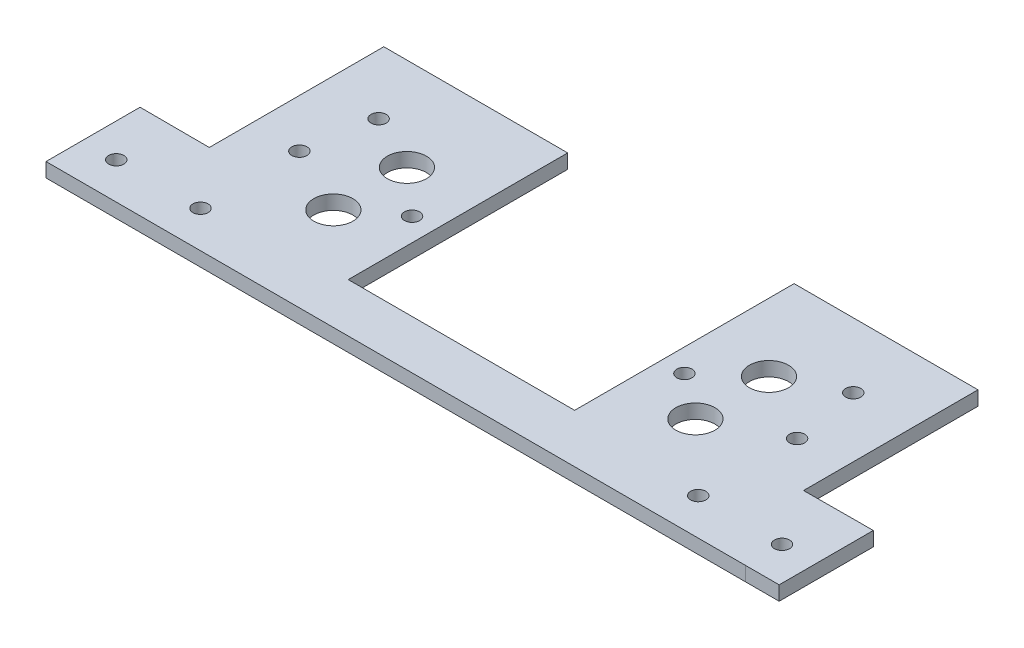
ISO-10303-21;
HEADER;
FILE_DESCRIPTION(('STEP AP214'),'2;1');
FILE_NAME('part.step','',(''),(''),'','','');
FILE_SCHEMA(('AUTOMOTIVE_DESIGN { 1 0 10303 214 1 1 1 1 }'));
ENDSEC;
DATA;
#1=APPLICATION_CONTEXT('core data for automotive mechanical design processes');
#2=APPLICATION_PROTOCOL_DEFINITION('international standard','automotive_design',2000,#1);
#3=PRODUCT_CONTEXT('',#1,'mechanical');
#4=PRODUCT('Part','Part','',(#3));
#5=PRODUCT_RELATED_PRODUCT_CATEGORY('part','',(#4));
#6=PRODUCT_DEFINITION_FORMATION('','',#4);
#7=PRODUCT_DEFINITION_CONTEXT('part definition',#1,'design');
#8=PRODUCT_DEFINITION('design','',#6,#7);
#9=PRODUCT_DEFINITION_SHAPE('','',#8);
#10=(LENGTH_UNIT() NAMED_UNIT(*) SI_UNIT(.MILLI.,.METRE.));
#11=(NAMED_UNIT(*) PLANE_ANGLE_UNIT() SI_UNIT($,.RADIAN.));
#12=(NAMED_UNIT(*) SI_UNIT($,.STERADIAN.) SOLID_ANGLE_UNIT());
#13=UNCERTAINTY_MEASURE_WITH_UNIT(LENGTH_MEASURE(1.E-05),#10,'distance_accuracy_value','');
#14=(GEOMETRIC_REPRESENTATION_CONTEXT(3) GLOBAL_UNCERTAINTY_ASSIGNED_CONTEXT((#13)) GLOBAL_UNIT_ASSIGNED_CONTEXT((#10,
#11,#12)) REPRESENTATION_CONTEXT('',''));
#15=CARTESIAN_POINT('',(0.,0.,0.));
#16=DIRECTION('',(0.,0.,1.));
#17=DIRECTION('',(1.,0.,0.));
#18=AXIS2_PLACEMENT_3D('',#15,#16,#17);
#19=CARTESIAN_POINT('',(0.,1.575,0.));
#20=DIRECTION('',(0.,-1.,0.));
#21=DIRECTION('',(0.,0.,-1.));
#22=AXIS2_PLACEMENT_3D('',#19,#20,#21);
#23=PLANE('',#22);
#24=CARTESIAN_POINT('',(27.8443972991951,1.575,35.9479468919469));
#25=DIRECTION('',(0.,-1.,0.));
#26=DIRECTION('',(0.,0.,-1.));
#27=AXIS2_PLACEMENT_3D('',#24,#25,#26);
#28=CIRCLE('',#27,0.838199999999997);
#29=CARTESIAN_POINT('',(27.8443972991951,1.575,35.1097468919469));
#30=VERTEX_POINT('',#29);
#31=EDGE_CURVE('E700',#30,#30,#28,.T.);
#32=ORIENTED_EDGE('',*,*,#31,.T.);
#33=EDGE_LOOP('',(#32));
#34=FACE_BOUND('',#33,.T.);
#35=CARTESIAN_POINT('',(27.8443972991951,1.575,25.0259468919469));
#36=DIRECTION('',(0.,-1.,0.));
#37=DIRECTION('',(0.,0.,-1.));
#38=AXIS2_PLACEMENT_3D('',#35,#36,#37);
#39=CIRCLE('',#38,0.838200000000001);
#40=CARTESIAN_POINT('',(27.8443972991951,1.575,24.1877468919469));
#41=VERTEX_POINT('',#40);
#42=EDGE_CURVE('E694',#41,#41,#39,.T.);
#43=ORIENTED_EDGE('',*,*,#42,.T.);
#44=EDGE_LOOP('',(#43));
#45=FACE_BOUND('',#44,.T.);
#46=CARTESIAN_POINT('',(15.3981432991951,1.575,25.0259468919469));
#47=DIRECTION('',(0.,-1.,0.));
#48=DIRECTION('',(0.,0.,-1.));
#49=AXIS2_PLACEMENT_3D('',#46,#47,#48);
#50=CIRCLE('',#49,0.838200000000005);
#51=CARTESIAN_POINT('',(15.3981432991951,1.575,24.1877468919469));
#52=VERTEX_POINT('',#51);
#53=EDGE_CURVE('E688',#52,#52,#50,.T.);
#54=ORIENTED_EDGE('',*,*,#53,.T.);
#55=EDGE_LOOP('',(#54));
#56=FACE_BOUND('',#55,.T.);
#57=CARTESIAN_POINT('',(-14.695556700805,1.575,25.0259468919469));
#58=DIRECTION('',(0.,-1.,0.));
#59=DIRECTION('',(0.,0.,-1.));
#60=AXIS2_PLACEMENT_3D('',#57,#58,#59);
#61=CIRCLE('',#60,0.838200000000001);
#62=CARTESIAN_POINT('',(-14.695556700805,1.575,24.1877468919469));
#63=VERTEX_POINT('',#62);
#64=EDGE_CURVE('E682',#63,#63,#61,.T.);
#65=ORIENTED_EDGE('',*,*,#64,.T.);
#66=EDGE_LOOP('',(#65));
#67=FACE_BOUND('',#66,.T.);
#68=CARTESIAN_POINT('',(-27.141556700805,1.575,25.0259468919469));
#69=DIRECTION('',(0.,-1.,0.));
#70=DIRECTION('',(0.,0.,-1.));
#71=AXIS2_PLACEMENT_3D('',#68,#69,#70);
#72=CIRCLE('',#71,0.838200000000001);
#73=CARTESIAN_POINT('',(-27.141556700805,1.575,24.1877468919469));
#74=VERTEX_POINT('',#73);
#75=EDGE_CURVE('E674',#74,#74,#72,.T.);
#76=ORIENTED_EDGE('',*,*,#75,.T.);
#77=EDGE_LOOP('',(#76));
#78=FACE_BOUND('',#77,.T.);
#79=CARTESIAN_POINT('',(-27.141556700805,1.575,35.9479468919469));
#80=DIRECTION('',(0.,-1.,0.));
#81=DIRECTION('',(0.,0.,-1.));
#82=AXIS2_PLACEMENT_3D('',#79,#80,#81);
#83=CIRCLE('',#82,0.838200000000004);
#84=CARTESIAN_POINT('',(-27.141556700805,1.575,35.1097468919469));
#85=VERTEX_POINT('',#84);
#86=EDGE_CURVE('E667',#85,#85,#83,.T.);
#87=ORIENTED_EDGE('',*,*,#86,.T.);
#88=EDGE_LOOP('',(#87));
#89=FACE_BOUND('',#88,.T.);
#90=CARTESIAN_POINT('',(26.5712932991951,1.575,17.5478756011429));
#91=DIRECTION('',(0.,1.,0.));
#92=DIRECTION('',(0.,0.,1.));
#93=AXIS2_PLACEMENT_3D('',#90,#91,#92);
#94=CIRCLE('',#93,0.838199999999997);
#95=CARTESIAN_POINT('',(26.5712932991951,1.575,18.3860756011429));
#96=VERTEX_POINT('',#95);
#97=EDGE_CURVE('E286',#96,#96,#94,.T.);
#98=ORIENTED_EDGE('',*,*,#97,.F.);
#99=EDGE_LOOP('',(#98));
#100=FACE_BOUND('',#99,.T.);
#101=CARTESIAN_POINT('',(20.351397299195,1.575,28.7673833497151));
#102=DIRECTION('',(0.,1.,0.));
#103=DIRECTION('',(0.,0.,1.));
#104=AXIS2_PLACEMENT_3D('',#101,#102,#103);
#105=CIRCLE('',#104,2.159);
#106=CARTESIAN_POINT('',(20.351397299195,1.575,30.9263833497151));
#107=VERTEX_POINT('',#106);
#108=EDGE_CURVE('E298',#107,#107,#105,.T.);
#109=ORIENTED_EDGE('',*,*,#108,.F.);
#110=EDGE_LOOP('',(#109));
#111=FACE_BOUND('',#110,.T.);
#112=CARTESIAN_POINT('',(-19.648556700805,1.575,20.6393833497151));
#113=DIRECTION('',(0.,1.,0.));
#114=DIRECTION('',(0.,0.,1.));
#115=AXIS2_PLACEMENT_3D('',#112,#113,#114);
#116=CIRCLE('',#115,2.159);
#117=CARTESIAN_POINT('',(-19.648556700805,1.575,22.7983833497151));
#118=VERTEX_POINT('',#117);
#119=EDGE_CURVE('E310',#118,#118,#116,.T.);
#120=ORIENTED_EDGE('',*,*,#119,.F.);
#121=EDGE_LOOP('',(#120));
#122=FACE_BOUND('',#121,.T.);
#123=CARTESIAN_POINT('',(-19.648556700805,1.575,28.7673833497151));
#124=DIRECTION('',(0.,1.,0.));
#125=DIRECTION('',(0.,0.,1.));
#126=AXIS2_PLACEMENT_3D('',#123,#124,#125);
#127=CIRCLE('',#126,2.159);
#128=CARTESIAN_POINT('',(-19.648556700805,1.575,30.9263833497151));
#129=VERTEX_POINT('',#128);
#130=EDGE_CURVE('E192',#129,#129,#127,.T.);
#131=ORIENTED_EDGE('',*,*,#130,.F.);
#132=EDGE_LOOP('',(#131));
#133=FACE_BOUND('',#132,.T.);
#134=DIRECTION('',(1.,0.,0.));
#135=VECTOR('',#134,1.);
#136=CARTESIAN_POINT('',(44.3512932991951,1.575,40.0144122461493));
#137=LINE('',#136,#135);
#138=CARTESIAN_POINT('',(37.1362932991951,1.575,40.0144122461493));
#139=VERTEX_POINT('',#138);
#140=CARTESIAN_POINT('',(40.8512932991951,1.575,40.0144122461493));
#141=VERTEX_POINT('',#140);
#142=EDGE_CURVE('E153',#139,#141,#137,.T.);
#143=ORIENTED_EDGE('',*,*,#142,.T.);
#144=DIRECTION('',(0.,0.,-1.));
#145=VECTOR('',#144,1.);
#146=CARTESIAN_POINT('',(40.8512932991951,1.575,40.0144122461493));
#147=LINE('',#146,#145);
#148=CARTESIAN_POINT('',(40.8512932991951,1.575,29.615946891947));
#149=VERTEX_POINT('',#148);
#150=EDGE_CURVE('E141',#141,#149,#147,.T.);
#151=ORIENTED_EDGE('',*,*,#150,.T.);
#152=DIRECTION('',(-1.,0.,0.));
#153=VECTOR('',#152,1.);
#154=CARTESIAN_POINT('',(42.3512933071951,1.575,29.615946891947));
#155=LINE('',#154,#153);
#156=CARTESIAN_POINT('',(38.7462933071951,1.575,29.615946891947));
#157=VERTEX_POINT('',#156);
#158=EDGE_CURVE('E161',#149,#157,#155,.T.);
#159=ORIENTED_EDGE('',*,*,#158,.T.);
#160=DIRECTION('',(-0.999983503458794,0.,0.00574393682727106));
#161=VECTOR('',#160,1.);
#162=CARTESIAN_POINT('',(38.7462933071951,1.575,29.615946891947));
#163=LINE('',#162,#161);
#164=CARTESIAN_POINT('',(33.1752932991951,1.575,29.647946891947));
#165=VERTEX_POINT('',#164);
#166=EDGE_CURVE('E164',#157,#165,#163,.T.);
#167=ORIENTED_EDGE('',*,*,#166,.T.);
#168=DIRECTION('',(0.,0.,-1.));
#169=VECTOR('',#168,1.);
#170=CARTESIAN_POINT('',(33.1752932991951,1.575,12.929386891947));
#171=LINE('',#170,#169);
#172=CARTESIAN_POINT('',(33.1752932991951,1.575,10.3704284449379));
#173=VERTEX_POINT('',#172);
#174=EDGE_CURVE('E173',#165,#173,#171,.T.);
#175=ORIENTED_EDGE('',*,*,#174,.T.);
#176=DIRECTION('',(-1.,0.,0.));
#177=VECTOR('',#176,1.);
#178=CARTESIAN_POINT('',(12.8581432991951,1.575,10.3704284449379));
#179=LINE('',#178,#177);
#180=CARTESIAN_POINT('',(12.8581432991951,1.575,10.3704284449379));
#181=VERTEX_POINT('',#180);
#182=EDGE_CURVE('E175',#173,#181,#179,.T.);
#183=ORIENTED_EDGE('',*,*,#182,.T.);
#184=DIRECTION('',(0.,0.,1.));
#185=VECTOR('',#184,1.);
#186=CARTESIAN_POINT('',(12.8581432991951,1.575,34.615947015947));
#187=LINE('',#186,#185);
#188=CARTESIAN_POINT('',(12.8581432991951,1.575,34.615947015947));
#189=VERTEX_POINT('',#188);
#190=EDGE_CURVE('E177',#181,#189,#187,.T.);
#191=ORIENTED_EDGE('',*,*,#190,.T.);
#192=DIRECTION('',(-1.,0.,0.));
#193=VECTOR('',#192,1.);
#194=CARTESIAN_POINT('',(12.2602932991951,1.575,34.615947015947));
#195=LINE('',#194,#193);
#196=CARTESIAN_POINT('',(-12.155556700805,1.575,34.6159470159469));
#197=VERTEX_POINT('',#196);
#198=EDGE_CURVE('E179',#189,#197,#195,.T.);
#199=ORIENTED_EDGE('',*,*,#198,.T.);
#200=DIRECTION('',(0.,0.,-1.));
#201=VECTOR('',#200,1.);
#202=CARTESIAN_POINT('',(-12.155556700805,1.575,34.6159470159469));
#203=LINE('',#202,#201);
#204=CARTESIAN_POINT('',(-12.155556700805,1.575,10.3704284449379));
#205=VERTEX_POINT('',#204);
#206=EDGE_CURVE('E181',#197,#205,#203,.T.);
#207=ORIENTED_EDGE('',*,*,#206,.T.);
#208=DIRECTION('',(-1.,0.,0.));
#209=VECTOR('',#208,1.);
#210=CARTESIAN_POINT('',(-12.155556700805,1.575,10.3704284449379));
#211=LINE('',#210,#209);
#212=CARTESIAN_POINT('',(-32.4727067008049,1.575,10.3704284449379));
#213=VERTEX_POINT('',#212);
#214=EDGE_CURVE('E183',#205,#213,#211,.T.);
#215=ORIENTED_EDGE('',*,*,#214,.T.);
#216=DIRECTION('',(0.,0.,1.));
#217=VECTOR('',#216,1.);
#218=CARTESIAN_POINT('',(-32.4727067008049,1.575,10.3704284449379));
#219=LINE('',#218,#217);
#220=CARTESIAN_POINT('',(-32.4727067008049,1.575,29.647946891947));
#221=VERTEX_POINT('',#220);
#222=EDGE_CURVE('E185',#213,#221,#219,.T.);
#223=ORIENTED_EDGE('',*,*,#222,.T.);
#224=DIRECTION('',(-0.999994782410405,0.,-0.00323034858297765));
#225=VECTOR('',#224,1.);
#226=CARTESIAN_POINT('',(-42.3787066928049,1.575,29.615946891947));
#227=LINE('',#226,#225);
#228=CARTESIAN_POINT('',(-40.1487067008049,1.575,29.6231506068472));
#229=VERTEX_POINT('',#228);
#230=EDGE_CURVE('E187',#221,#229,#227,.T.);
#231=ORIENTED_EDGE('',*,*,#230,.T.);
#232=DIRECTION('',(0.,0.,1.));
#233=VECTOR('',#232,1.);
#234=CARTESIAN_POINT('',(-40.1487067008049,1.575,40.013946891947));
#235=LINE('',#234,#233);
#236=CARTESIAN_POINT('',(-40.1487067008049,1.575,40.013946891947));
#237=VERTEX_POINT('',#236);
#238=EDGE_CURVE('E259',#229,#237,#235,.T.);
#239=ORIENTED_EDGE('',*,*,#238,.T.);
#240=DIRECTION('',(1.,0.,0.));
#241=VECTOR('',#240,1.);
#242=CARTESIAN_POINT('',(-49.1063653425043,1.575,40.013946891947));
#243=LINE('',#242,#241);
#244=CARTESIAN_POINT('',(37.1362932991951,1.575,40.013946891947));
#245=VERTEX_POINT('',#244);
#246=EDGE_CURVE('E271',#237,#245,#243,.T.);
#247=ORIENTED_EDGE('',*,*,#246,.T.);
#248=DIRECTION('',(0.,0.,1.));
#249=VECTOR('',#248,1.);
#250=CARTESIAN_POINT('',(37.1362932991951,1.575,40.013946891947));
#251=LINE('',#250,#249);
#252=EDGE_CURVE('E160',#245,#139,#251,.T.);
#253=ORIENTED_EDGE('',*,*,#252,.T.);
#254=EDGE_LOOP('',(#143,#151,#159,#167,#175,#183,#191,#199,#207,#215,#223,#231,#239,#247,#253));
#255=FACE_BOUND('',#254,.T.);
#256=CARTESIAN_POINT('',(37.1362932991951,1.575,35.983946891947));
#257=DIRECTION('',(0.,1.,0.));
#258=DIRECTION('',(0.,0.,1.));
#259=AXIS2_PLACEMENT_3D('',#256,#257,#258);
#260=CIRCLE('',#259,0.838199999999997);
#261=CARTESIAN_POINT('',(37.1362932991951,1.575,36.822146891947));
#262=VERTEX_POINT('',#261);
#263=EDGE_CURVE('E316',#262,#262,#260,.T.);
#264=ORIENTED_EDGE('',*,*,#263,.F.);
#265=EDGE_LOOP('',(#264));
#266=FACE_BOUND('',#265,.T.);
#267=CARTESIAN_POINT('',(20.351397299195,1.575,20.6393833497151));
#268=DIRECTION('',(0.,1.,0.));
#269=DIRECTION('',(0.,0.,1.));
#270=AXIS2_PLACEMENT_3D('',#267,#268,#269);
#271=CIRCLE('',#270,2.159);
#272=CARTESIAN_POINT('',(20.351397299195,1.575,22.7983833497151));
#273=VERTEX_POINT('',#272);
#274=EDGE_CURVE('E304',#273,#273,#271,.T.);
#275=ORIENTED_EDGE('',*,*,#274,.F.);
#276=EDGE_LOOP('',(#275));
#277=FACE_BOUND('',#276,.T.);
#278=CARTESIAN_POINT('',(-25.8687067008049,1.575,17.5478756011429));
#279=DIRECTION('',(0.,1.,0.));
#280=DIRECTION('',(0.,0.,1.));
#281=AXIS2_PLACEMENT_3D('',#278,#279,#280);
#282=CIRCLE('',#281,0.838200000000001);
#283=CARTESIAN_POINT('',(-25.8687067008049,1.575,18.3860756011429));
#284=VERTEX_POINT('',#283);
#285=EDGE_CURVE('E292',#284,#284,#282,.T.);
#286=ORIENTED_EDGE('',*,*,#285,.F.);
#287=EDGE_LOOP('',(#286));
#288=FACE_BOUND('',#287,.T.);
#289=CARTESIAN_POINT('',(-36.433706700805,1.575,35.9659468919469));
#290=DIRECTION('',(0.,1.,0.));
#291=DIRECTION('',(0.,0.,1.));
#292=AXIS2_PLACEMENT_3D('',#289,#290,#291);
#293=CIRCLE('',#292,0.838199999999995);
#294=CARTESIAN_POINT('',(-36.433706700805,1.575,36.8041468919469));
#295=VERTEX_POINT('',#294);
#296=EDGE_CURVE('E280',#295,#295,#293,.T.);
#297=ORIENTED_EDGE('',*,*,#296,.F.);
#298=EDGE_LOOP('',(#297));
#299=FACE_BOUND('',#298,.T.);
#300=ADVANCED_FACE('F35',(#34,#45,#56,#67,#78,#89,#100,#111,#122,#133,#255,#266,#277,#288,#299),
#23,.F.);
#301=CARTESIAN_POINT('',(0.,0.,0.));
#302=DIRECTION('',(0.,-1.,0.));
#303=DIRECTION('',(0.,0.,-1.));
#304=AXIS2_PLACEMENT_3D('',#301,#302,#303);
#305=PLANE('',#304);
#306=CARTESIAN_POINT('',(27.8443972991951,0.,35.9479468919469));
#307=DIRECTION('',(0.,-1.,0.));
#308=DIRECTION('',(0.,0.,-1.));
#309=AXIS2_PLACEMENT_3D('',#306,#307,#308);
#310=CIRCLE('',#309,0.838199999999997);
#311=CARTESIAN_POINT('',(27.8443972991951,0.,35.1097468919469));
#312=VERTEX_POINT('',#311);
#313=EDGE_CURVE('E702',#312,#312,#310,.T.);
#314=ORIENTED_EDGE('',*,*,#313,.F.);
#315=EDGE_LOOP('',(#314));
#316=FACE_BOUND('',#315,.T.);
#317=CARTESIAN_POINT('',(27.8443972991951,0.,25.0259468919469));
#318=DIRECTION('',(0.,-1.,0.));
#319=DIRECTION('',(0.,0.,-1.));
#320=AXIS2_PLACEMENT_3D('',#317,#318,#319);
#321=CIRCLE('',#320,0.838200000000001);
#322=CARTESIAN_POINT('',(27.8443972991951,0.,24.1877468919469));
#323=VERTEX_POINT('',#322);
#324=EDGE_CURVE('E697',#323,#323,#321,.T.);
#325=ORIENTED_EDGE('',*,*,#324,.F.);
#326=EDGE_LOOP('',(#325));
#327=FACE_BOUND('',#326,.T.);
#328=CARTESIAN_POINT('',(15.3981432991951,0.,25.0259468919469));
#329=DIRECTION('',(0.,-1.,0.));
#330=DIRECTION('',(0.,0.,-1.));
#331=AXIS2_PLACEMENT_3D('',#328,#329,#330);
#332=CIRCLE('',#331,0.838200000000005);
#333=CARTESIAN_POINT('',(15.3981432991951,0.,24.1877468919469));
#334=VERTEX_POINT('',#333);
#335=EDGE_CURVE('E691',#334,#334,#332,.T.);
#336=ORIENTED_EDGE('',*,*,#335,.F.);
#337=EDGE_LOOP('',(#336));
#338=FACE_BOUND('',#337,.T.);
#339=CARTESIAN_POINT('',(-14.695556700805,0.,25.0259468919469));
#340=DIRECTION('',(0.,-1.,0.));
#341=DIRECTION('',(0.,0.,-1.));
#342=AXIS2_PLACEMENT_3D('',#339,#340,#341);
#343=CIRCLE('',#342,0.838200000000001);
#344=CARTESIAN_POINT('',(-14.695556700805,0.,24.1877468919469));
#345=VERTEX_POINT('',#344);
#346=EDGE_CURVE('E685',#345,#345,#343,.T.);
#347=ORIENTED_EDGE('',*,*,#346,.F.);
#348=EDGE_LOOP('',(#347));
#349=FACE_BOUND('',#348,.T.);
#350=CARTESIAN_POINT('',(-27.141556700805,0.,25.0259468919469));
#351=DIRECTION('',(0.,-1.,0.));
#352=DIRECTION('',(0.,0.,-1.));
#353=AXIS2_PLACEMENT_3D('',#350,#351,#352);
#354=CIRCLE('',#353,0.838200000000001);
#355=CARTESIAN_POINT('',(-27.141556700805,0.,24.1877468919469));
#356=VERTEX_POINT('',#355);
#357=EDGE_CURVE('E679',#356,#356,#354,.T.);
#358=ORIENTED_EDGE('',*,*,#357,.F.);
#359=EDGE_LOOP('',(#358));
#360=FACE_BOUND('',#359,.T.);
#361=CARTESIAN_POINT('',(-27.141556700805,0.,35.9479468919469));
#362=DIRECTION('',(0.,-1.,0.));
#363=DIRECTION('',(0.,0.,-1.));
#364=AXIS2_PLACEMENT_3D('',#361,#362,#363);
#365=CIRCLE('',#364,0.838200000000004);
#366=CARTESIAN_POINT('',(-27.141556700805,0.,35.1097468919469));
#367=VERTEX_POINT('',#366);
#368=EDGE_CURVE('E669',#367,#367,#365,.T.);
#369=ORIENTED_EDGE('',*,*,#368,.F.);
#370=EDGE_LOOP('',(#369));
#371=FACE_BOUND('',#370,.T.);
#372=DIRECTION('',(0.,0.,-1.));
#373=VECTOR('',#372,1.);
#374=CARTESIAN_POINT('',(40.8512932991951,0.,32.4201044546138));
#375=LINE('',#374,#373);
#376=CARTESIAN_POINT('',(40.8512932991951,0.,40.0144122461493));
#377=VERTEX_POINT('',#376);
#378=CARTESIAN_POINT('',(40.8512932991951,0.,29.615946891947));
#379=VERTEX_POINT('',#378);
#380=EDGE_CURVE('E50',#377,#379,#375,.T.);
#381=ORIENTED_EDGE('',*,*,#380,.F.);
#382=DIRECTION('',(1.,0.,0.));
#383=VECTOR('',#382,1.);
#384=CARTESIAN_POINT('',(44.3512932991951,0.,40.0144122461493));
#385=LINE('',#384,#383);
#386=CARTESIAN_POINT('',(37.1362932991951,0.,40.0144122461493));
#387=VERTEX_POINT('',#386);
#388=EDGE_CURVE('E155',#387,#377,#385,.T.);
#389=ORIENTED_EDGE('',*,*,#388,.F.);
#390=DIRECTION('',(0.,0.,1.));
#391=VECTOR('',#390,1.);
#392=CARTESIAN_POINT('',(37.1362932991951,0.,40.013946891947));
#393=LINE('',#392,#391);
#394=CARTESIAN_POINT('',(37.1362932991951,0.,40.013946891947));
#395=VERTEX_POINT('',#394);
#396=EDGE_CURVE('E268',#395,#387,#393,.T.);
#397=ORIENTED_EDGE('',*,*,#396,.F.);
#398=DIRECTION('',(1.,0.,0.));
#399=VECTOR('',#398,1.);
#400=CARTESIAN_POINT('',(-49.1063653425043,0.,40.013946891947));
#401=LINE('',#400,#399);
#402=CARTESIAN_POINT('',(-40.1487067008049,0.,40.013946891947));
#403=VERTEX_POINT('',#402);
#404=EDGE_CURVE('E272',#403,#395,#401,.T.);
#405=ORIENTED_EDGE('',*,*,#404,.F.);
#406=DIRECTION('',(0.,0.,1.));
#407=VECTOR('',#406,1.);
#408=CARTESIAN_POINT('',(-40.1487067008049,0.,40.013946891947));
#409=LINE('',#408,#407);
#410=CARTESIAN_POINT('',(-40.1487067008049,0.,29.6231506068472));
#411=VERTEX_POINT('',#410);
#412=EDGE_CURVE('E58',#411,#403,#409,.T.);
#413=ORIENTED_EDGE('',*,*,#412,.F.);
#414=DIRECTION('',(-0.999994782410405,0.,-0.00323034858297765));
#415=VECTOR('',#414,1.);
#416=CARTESIAN_POINT('',(-42.3787066928049,0.,29.615946891947));
#417=LINE('',#416,#415);
#418=CARTESIAN_POINT('',(-32.4727067008049,0.,29.647946891947));
#419=VERTEX_POINT('',#418);
#420=EDGE_CURVE('E162',#419,#411,#417,.T.);
#421=ORIENTED_EDGE('',*,*,#420,.F.);
#422=DIRECTION('',(0.,0.,1.));
#423=VECTOR('',#422,1.);
#424=CARTESIAN_POINT('',(-32.4727067008049,0.,10.3704284449379));
#425=LINE('',#424,#423);
#426=CARTESIAN_POINT('',(-32.4727067008049,0.,10.3704284449379));
#427=VERTEX_POINT('',#426);
#428=EDGE_CURVE('E166',#427,#419,#425,.T.);
#429=ORIENTED_EDGE('',*,*,#428,.F.);
#430=DIRECTION('',(-1.,0.,0.));
#431=VECTOR('',#430,1.);
#432=CARTESIAN_POINT('',(-12.155556700805,0.,10.3704284449379));
#433=LINE('',#432,#431);
#434=CARTESIAN_POINT('',(-12.155556700805,0.,10.3704284449379));
#435=VERTEX_POINT('',#434);
#436=EDGE_CURVE('E208',#435,#427,#433,.T.);
#437=ORIENTED_EDGE('',*,*,#436,.F.);
#438=DIRECTION('',(0.,0.,-1.));
#439=VECTOR('',#438,1.);
#440=CARTESIAN_POINT('',(-12.155556700805,0.,34.6159470159469));
#441=LINE('',#440,#439);
#442=CARTESIAN_POINT('',(-12.155556700805,0.,34.6159470159469));
#443=VERTEX_POINT('',#442);
#444=EDGE_CURVE('E206',#443,#435,#441,.T.);
#445=ORIENTED_EDGE('',*,*,#444,.F.);
#446=DIRECTION('',(-1.,0.,0.));
#447=VECTOR('',#446,1.);
#448=CARTESIAN_POINT('',(-11.5577067008049,0.,34.6159470159469));
#449=LINE('',#448,#447);
#450=CARTESIAN_POINT('',(12.8581432991951,0.,34.615947015947));
#451=VERTEX_POINT('',#450);
#452=EDGE_CURVE('E204',#451,#443,#449,.T.);
#453=ORIENTED_EDGE('',*,*,#452,.F.);
#454=DIRECTION('',(0.,0.,1.));
#455=VECTOR('',#454,1.);
#456=CARTESIAN_POINT('',(12.8581432991951,0.,34.615947015947));
#457=LINE('',#456,#455);
#458=CARTESIAN_POINT('',(12.8581432991951,0.,10.3704284449379));
#459=VERTEX_POINT('',#458);
#460=EDGE_CURVE('E201',#459,#451,#457,.T.);
#461=ORIENTED_EDGE('',*,*,#460,.F.);
#462=DIRECTION('',(-1.,0.,0.));
#463=VECTOR('',#462,1.);
#464=CARTESIAN_POINT('',(12.8581432991951,0.,10.3704284449379));
#465=LINE('',#464,#463);
#466=CARTESIAN_POINT('',(33.1752932991951,0.,10.3704284449379));
#467=VERTEX_POINT('',#466);
#468=EDGE_CURVE('E199',#467,#459,#465,.T.);
#469=ORIENTED_EDGE('',*,*,#468,.F.);
#470=DIRECTION('',(0.,0.,-1.));
#471=VECTOR('',#470,1.);
#472=CARTESIAN_POINT('',(33.1752932991951,0.,10.3704284449379));
#473=LINE('',#472,#471);
#474=CARTESIAN_POINT('',(33.1752932991951,0.,29.647946891947));
#475=VERTEX_POINT('',#474);
#476=EDGE_CURVE('E197',#475,#467,#473,.T.);
#477=ORIENTED_EDGE('',*,*,#476,.F.);
#478=DIRECTION('',(-0.999983503458794,0.,0.00574393682727106));
#479=VECTOR('',#478,1.);
#480=CARTESIAN_POINT('',(38.7462933071951,0.,29.615946891947));
#481=LINE('',#480,#479);
#482=CARTESIAN_POINT('',(38.7462933071951,0.,29.615946891947));
#483=VERTEX_POINT('',#482);
#484=EDGE_CURVE('E194',#483,#475,#481,.T.);
#485=ORIENTED_EDGE('',*,*,#484,.F.);
#486=DIRECTION('',(-1.,0.,0.));
#487=VECTOR('',#486,1.);
#488=CARTESIAN_POINT('',(42.3512933071951,0.,29.615946891947));
#489=LINE('',#488,#487);
#490=EDGE_CURVE('E191',#379,#483,#489,.T.);
#491=ORIENTED_EDGE('',*,*,#490,.F.);
#492=EDGE_LOOP('',(#381,#389,#397,#405,#413,#421,#429,#437,#445,#453,#461,#469,#477,#485,#491));
#493=FACE_BOUND('',#492,.T.);
#494=CARTESIAN_POINT('',(26.5712932991951,0.,17.5478756011429));
#495=DIRECTION('',(0.,1.,0.));
#496=DIRECTION('',(0.,0.,1.));
#497=AXIS2_PLACEMENT_3D('',#494,#495,#496);
#498=CIRCLE('',#497,0.838199999999997);
#499=CARTESIAN_POINT('',(26.5712932991951,0.,18.3860756011429));
#500=VERTEX_POINT('',#499);
#501=EDGE_CURVE('E283',#500,#500,#498,.T.);
#502=ORIENTED_EDGE('',*,*,#501,.T.);
#503=EDGE_LOOP('',(#502));
#504=FACE_BOUND('',#503,.T.);
#505=CARTESIAN_POINT('',(20.351397299195,0.,28.7673833497151));
#506=DIRECTION('',(0.,1.,0.));
#507=DIRECTION('',(0.,0.,1.));
#508=AXIS2_PLACEMENT_3D('',#505,#506,#507);
#509=CIRCLE('',#508,2.159);
#510=CARTESIAN_POINT('',(20.351397299195,0.,30.9263833497151));
#511=VERTEX_POINT('',#510);
#512=EDGE_CURVE('E295',#511,#511,#509,.T.);
#513=ORIENTED_EDGE('',*,*,#512,.T.);
#514=EDGE_LOOP('',(#513));
#515=FACE_BOUND('',#514,.T.);
#516=CARTESIAN_POINT('',(-19.648556700805,0.,20.6393833497151));
#517=DIRECTION('',(0.,1.,0.));
#518=DIRECTION('',(0.,0.,1.));
#519=AXIS2_PLACEMENT_3D('',#516,#517,#518);
#520=CIRCLE('',#519,2.159);
#521=CARTESIAN_POINT('',(-19.648556700805,0.,22.7983833497151));
#522=VERTEX_POINT('',#521);
#523=EDGE_CURVE('E307',#522,#522,#520,.T.);
#524=ORIENTED_EDGE('',*,*,#523,.T.);
#525=EDGE_LOOP('',(#524));
#526=FACE_BOUND('',#525,.T.);
#527=CARTESIAN_POINT('',(-19.648556700805,0.,28.7673833497151));
#528=DIRECTION('',(0.,1.,0.));
#529=DIRECTION('',(0.,0.,1.));
#530=AXIS2_PLACEMENT_3D('',#527,#528,#529);
#531=CIRCLE('',#530,2.159);
#532=CARTESIAN_POINT('',(-19.648556700805,0.,30.9263833497151));
#533=VERTEX_POINT('',#532);
#534=EDGE_CURVE('E169',#533,#533,#531,.T.);
#535=ORIENTED_EDGE('',*,*,#534,.T.);
#536=EDGE_LOOP('',(#535));
#537=FACE_BOUND('',#536,.T.);
#538=CARTESIAN_POINT('',(37.1362932991951,0.,35.983946891947));
#539=DIRECTION('',(0.,1.,0.));
#540=DIRECTION('',(0.,0.,1.));
#541=AXIS2_PLACEMENT_3D('',#538,#539,#540);
#542=CIRCLE('',#541,0.838199999999997);
#543=CARTESIAN_POINT('',(37.1362932991951,0.,36.822146891947));
#544=VERTEX_POINT('',#543);
#545=EDGE_CURVE('E313',#544,#544,#542,.T.);
#546=ORIENTED_EDGE('',*,*,#545,.T.);
#547=EDGE_LOOP('',(#546));
#548=FACE_BOUND('',#547,.T.);
#549=CARTESIAN_POINT('',(20.351397299195,0.,20.6393833497151));
#550=DIRECTION('',(0.,1.,0.));
#551=DIRECTION('',(0.,0.,1.));
#552=AXIS2_PLACEMENT_3D('',#549,#550,#551);
#553=CIRCLE('',#552,2.159);
#554=CARTESIAN_POINT('',(20.351397299195,0.,22.7983833497151));
#555=VERTEX_POINT('',#554);
#556=EDGE_CURVE('E301',#555,#555,#553,.T.);
#557=ORIENTED_EDGE('',*,*,#556,.T.);
#558=EDGE_LOOP('',(#557));
#559=FACE_BOUND('',#558,.T.);
#560=CARTESIAN_POINT('',(-25.8687067008049,0.,17.5478756011429));
#561=DIRECTION('',(0.,1.,0.));
#562=DIRECTION('',(0.,0.,1.));
#563=AXIS2_PLACEMENT_3D('',#560,#561,#562);
#564=CIRCLE('',#563,0.838200000000001);
#565=CARTESIAN_POINT('',(-25.8687067008049,0.,18.3860756011429));
#566=VERTEX_POINT('',#565);
#567=EDGE_CURVE('E289',#566,#566,#564,.T.);
#568=ORIENTED_EDGE('',*,*,#567,.T.);
#569=EDGE_LOOP('',(#568));
#570=FACE_BOUND('',#569,.T.);
#571=CARTESIAN_POINT('',(-36.433706700805,0.,35.9659468919469));
#572=DIRECTION('',(0.,1.,0.));
#573=DIRECTION('',(0.,0.,1.));
#574=AXIS2_PLACEMENT_3D('',#571,#572,#573);
#575=CIRCLE('',#574,0.838199999999995);
#576=CARTESIAN_POINT('',(-36.433706700805,0.,36.8041468919469));
#577=VERTEX_POINT('',#576);
#578=EDGE_CURVE('E279',#577,#577,#575,.T.);
#579=ORIENTED_EDGE('',*,*,#578,.T.);
#580=EDGE_LOOP('',(#579));
#581=FACE_BOUND('',#580,.T.);
#582=ADVANCED_FACE('F243',(#316,#327,#338,#349,#360,#371,#493,#504,#515,#526,#537,#548,#559,
#570,#581),#305,.T.);
#583=CARTESIAN_POINT('',(44.3512932991951,1.575,40.0144122461493));
#584=DIRECTION('',(0.,0.,-1.));
#585=DIRECTION('',(-1.,0.,0.));
#586=AXIS2_PLACEMENT_3D('',#583,#584,#585);
#587=PLANE('',#586);
#588=ORIENTED_EDGE('',*,*,#388,.T.);
#589=DIRECTION('',(0.,-1.,0.));
#590=VECTOR('',#589,1.);
#591=CARTESIAN_POINT('',(40.8512932991951,1.575,40.0144122461493));
#592=LINE('',#591,#590);
#593=EDGE_CURVE('E144',#141,#377,#592,.T.);
#594=ORIENTED_EDGE('',*,*,#593,.F.);
#595=ORIENTED_EDGE('',*,*,#142,.F.);
#596=DIRECTION('',(0.,-1.,0.));
#597=VECTOR('',#596,1.);
#598=CARTESIAN_POINT('',(37.1362932991951,1.575,40.0144122461493));
#599=LINE('',#598,#597);
#600=EDGE_CURVE('E11',#139,#387,#599,.T.);
#601=ORIENTED_EDGE('',*,*,#600,.T.);
#602=EDGE_LOOP('',(#588,#594,#595,#601));
#603=FACE_BOUND('',#602,.T.);
#604=ADVANCED_FACE('F37',(#603),#587,.F.);
#605=CARTESIAN_POINT('',(42.3512933071951,1.575,29.615946891947));
#606=DIRECTION('',(0.,0.,1.));
#607=DIRECTION('',(1.,0.,0.));
#608=AXIS2_PLACEMENT_3D('',#605,#606,#607);
#609=PLANE('',#608);
#610=ORIENTED_EDGE('',*,*,#158,.F.);
#611=DIRECTION('',(0.,-1.,0.));
#612=VECTOR('',#611,1.);
#613=CARTESIAN_POINT('',(40.8512932991951,1.575,29.615946891947));
#614=LINE('',#613,#612);
#615=EDGE_CURVE('E145',#149,#379,#614,.T.);
#616=ORIENTED_EDGE('',*,*,#615,.T.);
#617=ORIENTED_EDGE('',*,*,#490,.T.);
#618=DIRECTION('',(0.,-1.,0.));
#619=VECTOR('',#618,1.);
#620=CARTESIAN_POINT('',(38.7462933071951,1.575,29.615946891947));
#621=LINE('',#620,#619);
#622=EDGE_CURVE('E43',#157,#483,#621,.T.);
#623=ORIENTED_EDGE('',*,*,#622,.F.);
#624=EDGE_LOOP('',(#610,#616,#617,#623));
#625=FACE_BOUND('',#624,.T.);
#626=ADVANCED_FACE('F257',(#625),#609,.F.);
#627=CARTESIAN_POINT('',(38.7462933071951,1.575,29.615946891947));
#628=DIRECTION('',(0.00574393682727106,0.,0.999983503458794));
#629=DIRECTION('',(0.999983503458794,0.,-0.00574393682727106));
#630=AXIS2_PLACEMENT_3D('',#627,#628,#629);
#631=PLANE('',#630);
#632=ORIENTED_EDGE('',*,*,#484,.T.);
#633=DIRECTION('',(0.,-1.,0.));
#634=VECTOR('',#633,1.);
#635=CARTESIAN_POINT('',(33.1752932991951,1.575,29.647946891947));
#636=LINE('',#635,#634);
#637=EDGE_CURVE('E231',#165,#475,#636,.T.);
#638=ORIENTED_EDGE('',*,*,#637,.F.);
#639=ORIENTED_EDGE('',*,*,#166,.F.);
#640=ORIENTED_EDGE('',*,*,#622,.T.);
#641=EDGE_LOOP('',(#632,#638,#639,#640));
#642=FACE_BOUND('',#641,.T.);
#643=ADVANCED_FACE('F238',(#642),#631,.F.);
#644=CARTESIAN_POINT('',(33.1752932991951,1.575,10.3704284449379));
#645=DIRECTION('',(-1.,0.,0.));
#646=DIRECTION('',(0.,0.,1.));
#647=AXIS2_PLACEMENT_3D('',#644,#645,#646);
#648=PLANE('',#647);
#649=ORIENTED_EDGE('',*,*,#476,.T.);
#650=DIRECTION('',(0.,-1.,0.));
#651=VECTOR('',#650,1.);
#652=CARTESIAN_POINT('',(33.1752932991951,1.575,10.3704284449379));
#653=LINE('',#652,#651);
#654=EDGE_CURVE('E228',#173,#467,#653,.T.);
#655=ORIENTED_EDGE('',*,*,#654,.F.);
#656=ORIENTED_EDGE('',*,*,#174,.F.);
#657=ORIENTED_EDGE('',*,*,#637,.T.);
#658=EDGE_LOOP('',(#649,#655,#656,#657));
#659=FACE_BOUND('',#658,.T.);
#660=ADVANCED_FACE('F249',(#659),#648,.F.);
#661=CARTESIAN_POINT('',(12.8581432991951,1.575,10.3704284449379));
#662=DIRECTION('',(0.,0.,1.));
#663=DIRECTION('',(1.,0.,0.));
#664=AXIS2_PLACEMENT_3D('',#661,#662,#663);
#665=PLANE('',#664);
#666=ORIENTED_EDGE('',*,*,#468,.T.);
#667=DIRECTION('',(0.,-1.,0.));
#668=VECTOR('',#667,1.);
#669=CARTESIAN_POINT('',(12.8581432991951,1.575,10.3704284449379));
#670=LINE('',#669,#668);
#671=EDGE_CURVE('E225',#181,#459,#670,.T.);
#672=ORIENTED_EDGE('',*,*,#671,.F.);
#673=ORIENTED_EDGE('',*,*,#182,.F.);
#674=ORIENTED_EDGE('',*,*,#654,.T.);
#675=EDGE_LOOP('',(#666,#672,#673,#674));
#676=FACE_BOUND('',#675,.T.);
#677=ADVANCED_FACE('F253',(#676),#665,.F.);
#678=CARTESIAN_POINT('',(12.8581432991951,1.575,34.615947015947));
#679=DIRECTION('',(1.,0.,0.));
#680=DIRECTION('',(0.,0.,-1.));
#681=AXIS2_PLACEMENT_3D('',#678,#679,#680);
#682=PLANE('',#681);
#683=ORIENTED_EDGE('',*,*,#460,.T.);
#684=DIRECTION('',(0.,-1.,0.));
#685=VECTOR('',#684,1.);
#686=CARTESIAN_POINT('',(12.8581432991951,1.575,34.615947015947));
#687=LINE('',#686,#685);
#688=EDGE_CURVE('E222',#189,#451,#687,.T.);
#689=ORIENTED_EDGE('',*,*,#688,.F.);
#690=ORIENTED_EDGE('',*,*,#190,.F.);
#691=ORIENTED_EDGE('',*,*,#671,.T.);
#692=EDGE_LOOP('',(#683,#689,#690,#691));
#693=FACE_BOUND('',#692,.T.);
#694=ADVANCED_FACE('F368',(#693),#682,.F.);
#695=CARTESIAN_POINT('',(-11.5577067008049,1.575,34.6159470159469));
#696=DIRECTION('',(0.,0.,1.));
#697=DIRECTION('',(1.,0.,0.));
#698=AXIS2_PLACEMENT_3D('',#695,#696,#697);
#699=PLANE('',#698);
#700=ORIENTED_EDGE('',*,*,#452,.T.);
#701=DIRECTION('',(0.,-1.,0.));
#702=VECTOR('',#701,1.);
#703=CARTESIAN_POINT('',(-12.155556700805,1.575,34.6159470159469));
#704=LINE('',#703,#702);
#705=EDGE_CURVE('E219',#197,#443,#704,.T.);
#706=ORIENTED_EDGE('',*,*,#705,.F.);
#707=ORIENTED_EDGE('',*,*,#198,.F.);
#708=ORIENTED_EDGE('',*,*,#688,.T.);
#709=EDGE_LOOP('',(#700,#706,#707,#708));
#710=FACE_BOUND('',#709,.T.);
#711=ADVANCED_FACE('F364',(#710),#699,.F.);
#712=CARTESIAN_POINT('',(-12.155556700805,1.575,34.6159470159469));
#713=DIRECTION('',(-1.,0.,0.));
#714=DIRECTION('',(0.,0.,1.));
#715=AXIS2_PLACEMENT_3D('',#712,#713,#714);
#716=PLANE('',#715);
#717=ORIENTED_EDGE('',*,*,#444,.T.);
#718=DIRECTION('',(0.,-1.,0.));
#719=VECTOR('',#718,1.);
#720=CARTESIAN_POINT('',(-12.155556700805,1.575,10.3704284449379));
#721=LINE('',#720,#719);
#722=EDGE_CURVE('E216',#205,#435,#721,.T.);
#723=ORIENTED_EDGE('',*,*,#722,.F.);
#724=ORIENTED_EDGE('',*,*,#206,.F.);
#725=ORIENTED_EDGE('',*,*,#705,.T.);
#726=EDGE_LOOP('',(#717,#723,#724,#725));
#727=FACE_BOUND('',#726,.T.);
#728=ADVANCED_FACE('F360',(#727),#716,.F.);
#729=CARTESIAN_POINT('',(-12.155556700805,1.575,10.3704284449379));
#730=DIRECTION('',(0.,0.,1.));
#731=DIRECTION('',(1.,0.,0.));
#732=AXIS2_PLACEMENT_3D('',#729,#730,#731);
#733=PLANE('',#732);
#734=ORIENTED_EDGE('',*,*,#436,.T.);
#735=DIRECTION('',(0.,-1.,0.));
#736=VECTOR('',#735,1.);
#737=CARTESIAN_POINT('',(-32.4727067008049,1.575,10.3704284449379));
#738=LINE('',#737,#736);
#739=EDGE_CURVE('E213',#213,#427,#738,.T.);
#740=ORIENTED_EDGE('',*,*,#739,.F.);
#741=ORIENTED_EDGE('',*,*,#214,.F.);
#742=ORIENTED_EDGE('',*,*,#722,.T.);
#743=EDGE_LOOP('',(#734,#740,#741,#742));
#744=FACE_BOUND('',#743,.T.);
#745=ADVANCED_FACE('F356',(#744),#733,.F.);
#746=CARTESIAN_POINT('',(-32.4727067008049,1.575,10.3704284449379));
#747=DIRECTION('',(1.,0.,0.));
#748=DIRECTION('',(0.,0.,-1.));
#749=AXIS2_PLACEMENT_3D('',#746,#747,#748);
#750=PLANE('',#749);
#751=ORIENTED_EDGE('',*,*,#428,.T.);
#752=DIRECTION('',(0.,-1.,0.));
#753=VECTOR('',#752,1.);
#754=CARTESIAN_POINT('',(-32.4727067008049,1.575,29.647946891947));
#755=LINE('',#754,#753);
#756=EDGE_CURVE('E189',#221,#419,#755,.T.);
#757=ORIENTED_EDGE('',*,*,#756,.F.);
#758=ORIENTED_EDGE('',*,*,#222,.F.);
#759=ORIENTED_EDGE('',*,*,#739,.T.);
#760=EDGE_LOOP('',(#751,#757,#758,#759));
#761=FACE_BOUND('',#760,.T.);
#762=ADVANCED_FACE('F340',(#761),#750,.F.);
#763=CARTESIAN_POINT('',(-42.3787066928049,1.575,29.615946891947));
#764=DIRECTION('',(-0.00323034858297765,0.,0.999994782410405));
#765=DIRECTION('',(0.999994782410405,0.,0.00323034858297765));
#766=AXIS2_PLACEMENT_3D('',#763,#764,#765);
#767=PLANE('',#766);
#768=ORIENTED_EDGE('',*,*,#420,.T.);
#769=DIRECTION('',(0.,-1.,0.));
#770=VECTOR('',#769,1.);
#771=CARTESIAN_POINT('',(-40.1487067008049,1.575,29.6231506068472));
#772=LINE('',#771,#770);
#773=EDGE_CURVE('E264',#229,#411,#772,.T.);
#774=ORIENTED_EDGE('',*,*,#773,.F.);
#775=ORIENTED_EDGE('',*,*,#230,.F.);
#776=ORIENTED_EDGE('',*,*,#756,.T.);
#777=EDGE_LOOP('',(#768,#774,#775,#776));
#778=FACE_BOUND('',#777,.T.);
#779=ADVANCED_FACE('F331',(#778),#767,.F.);
#780=CARTESIAN_POINT('',(-19.648556700805,1.575,28.7673833497151));
#781=DIRECTION('',(0.,-1.,0.));
#782=DIRECTION('',(0.,0.,-1.));
#783=AXIS2_PLACEMENT_3D('',#780,#781,#782);
#784=CYLINDRICAL_SURFACE('',#783,2.159);
#785=ORIENTED_EDGE('',*,*,#130,.T.);
#786=EDGE_LOOP('',(#785));
#787=FACE_BOUND('',#786,.T.);
#788=ORIENTED_EDGE('',*,*,#534,.F.);
#789=EDGE_LOOP('',(#788));
#790=FACE_BOUND('',#789,.T.);
#791=ADVANCED_FACE('F328',(#787,#790),#784,.F.);
#792=CARTESIAN_POINT('',(37.1362932991951,1.575,35.983946891947));
#793=DIRECTION('',(0.,-1.,0.));
#794=DIRECTION('',(0.,0.,-1.));
#795=AXIS2_PLACEMENT_3D('',#792,#793,#794);
#796=CYLINDRICAL_SURFACE('',#795,0.838199999999997);
#797=ORIENTED_EDGE('',*,*,#263,.T.);
#798=EDGE_LOOP('',(#797));
#799=FACE_BOUND('',#798,.T.);
#800=ORIENTED_EDGE('',*,*,#545,.F.);
#801=EDGE_LOOP('',(#800));
#802=FACE_BOUND('',#801,.T.);
#803=ADVANCED_FACE('F330',(#799,#802),#796,.F.);
#804=CARTESIAN_POINT('',(-19.648556700805,1.575,20.6393833497151));
#805=DIRECTION('',(0.,-1.,0.));
#806=DIRECTION('',(0.,0.,-1.));
#807=AXIS2_PLACEMENT_3D('',#804,#805,#806);
#808=CYLINDRICAL_SURFACE('',#807,2.159);
#809=ORIENTED_EDGE('',*,*,#119,.T.);
#810=EDGE_LOOP('',(#809));
#811=FACE_BOUND('',#810,.T.);
#812=ORIENTED_EDGE('',*,*,#523,.F.);
#813=EDGE_LOOP('',(#812));
#814=FACE_BOUND('',#813,.T.);
#815=ADVANCED_FACE('F337',(#811,#814),#808,.F.);
#816=CARTESIAN_POINT('',(20.351397299195,1.575,20.6393833497151));
#817=DIRECTION('',(0.,-1.,0.));
#818=DIRECTION('',(0.,0.,-1.));
#819=AXIS2_PLACEMENT_3D('',#816,#817,#818);
#820=CYLINDRICAL_SURFACE('',#819,2.159);
#821=ORIENTED_EDGE('',*,*,#274,.T.);
#822=EDGE_LOOP('',(#821));
#823=FACE_BOUND('',#822,.T.);
#824=ORIENTED_EDGE('',*,*,#556,.F.);
#825=EDGE_LOOP('',(#824));
#826=FACE_BOUND('',#825,.T.);
#827=ADVANCED_FACE('F488',(#823,#826),#820,.F.);
#828=CARTESIAN_POINT('',(20.351397299195,1.575,28.7673833497151));
#829=DIRECTION('',(0.,-1.,0.));
#830=DIRECTION('',(0.,0.,-1.));
#831=AXIS2_PLACEMENT_3D('',#828,#829,#830);
#832=CYLINDRICAL_SURFACE('',#831,2.159);
#833=ORIENTED_EDGE('',*,*,#108,.T.);
#834=EDGE_LOOP('',(#833));
#835=FACE_BOUND('',#834,.T.);
#836=ORIENTED_EDGE('',*,*,#512,.F.);
#837=EDGE_LOOP('',(#836));
#838=FACE_BOUND('',#837,.T.);
#839=ADVANCED_FACE('F484',(#835,#838),#832,.F.);
#840=CARTESIAN_POINT('',(-25.8687067008049,1.575,17.5478756011429));
#841=DIRECTION('',(0.,-1.,0.));
#842=DIRECTION('',(0.,0.,-1.));
#843=AXIS2_PLACEMENT_3D('',#840,#841,#842);
#844=CYLINDRICAL_SURFACE('',#843,0.838200000000001);
#845=ORIENTED_EDGE('',*,*,#285,.T.);
#846=EDGE_LOOP('',(#845));
#847=FACE_BOUND('',#846,.T.);
#848=ORIENTED_EDGE('',*,*,#567,.F.);
#849=EDGE_LOOP('',(#848));
#850=FACE_BOUND('',#849,.T.);
#851=ADVANCED_FACE('F480',(#847,#850),#844,.F.);
#852=CARTESIAN_POINT('',(26.5712932991951,1.575,17.5478756011429));
#853=DIRECTION('',(0.,-1.,0.));
#854=DIRECTION('',(0.,0.,-1.));
#855=AXIS2_PLACEMENT_3D('',#852,#853,#854);
#856=CYLINDRICAL_SURFACE('',#855,0.838199999999997);
#857=ORIENTED_EDGE('',*,*,#97,.T.);
#858=EDGE_LOOP('',(#857));
#859=FACE_BOUND('',#858,.T.);
#860=ORIENTED_EDGE('',*,*,#501,.F.);
#861=EDGE_LOOP('',(#860));
#862=FACE_BOUND('',#861,.T.);
#863=ADVANCED_FACE('F476',(#859,#862),#856,.F.);
#864=CARTESIAN_POINT('',(-36.433706700805,1.575,35.9659468919469));
#865=DIRECTION('',(0.,-1.,0.));
#866=DIRECTION('',(0.,0.,-1.));
#867=AXIS2_PLACEMENT_3D('',#864,#865,#866);
#868=CYLINDRICAL_SURFACE('',#867,0.838199999999995);
#869=ORIENTED_EDGE('',*,*,#296,.T.);
#870=EDGE_LOOP('',(#869));
#871=FACE_BOUND('',#870,.T.);
#872=ORIENTED_EDGE('',*,*,#578,.F.);
#873=EDGE_LOOP('',(#872));
#874=FACE_BOUND('',#873,.T.);
#875=ADVANCED_FACE('F469',(#871,#874),#868,.F.);
#876=CARTESIAN_POINT('',(-49.1063653425043,1.575,40.013946891947));
#877=DIRECTION('',(0.,0.,-1.));
#878=DIRECTION('',(-1.,0.,0.));
#879=AXIS2_PLACEMENT_3D('',#876,#877,#878);
#880=PLANE('',#879);
#881=ORIENTED_EDGE('',*,*,#246,.F.);
#882=DIRECTION('',(0.,-1.,0.));
#883=VECTOR('',#882,1.);
#884=CARTESIAN_POINT('',(-40.1487067008049,1.575,40.013946891947));
#885=LINE('',#884,#883);
#886=EDGE_CURVE('E266',#237,#403,#885,.T.);
#887=ORIENTED_EDGE('',*,*,#886,.T.);
#888=ORIENTED_EDGE('',*,*,#404,.T.);
#889=DIRECTION('',(0.,-1.,0.));
#890=VECTOR('',#889,1.);
#891=CARTESIAN_POINT('',(37.1362932991951,1.575,40.013946891947));
#892=LINE('',#891,#890);
#893=EDGE_CURVE('E274',#245,#395,#892,.T.);
#894=ORIENTED_EDGE('',*,*,#893,.F.);
#895=EDGE_LOOP('',(#881,#887,#888,#894));
#896=FACE_BOUND('',#895,.T.);
#897=ADVANCED_FACE('F466',(#896),#880,.F.);
#898=CARTESIAN_POINT('',(37.1362932991951,1.575,40.013946891947));
#899=DIRECTION('',(1.,0.,0.));
#900=DIRECTION('',(0.,0.,-1.));
#901=AXIS2_PLACEMENT_3D('',#898,#899,#900);
#902=PLANE('',#901);
#903=ORIENTED_EDGE('',*,*,#252,.F.);
#904=ORIENTED_EDGE('',*,*,#893,.T.);
#905=ORIENTED_EDGE('',*,*,#396,.T.);
#906=ORIENTED_EDGE('',*,*,#600,.F.);
#907=EDGE_LOOP('',(#903,#904,#905,#906));
#908=FACE_BOUND('',#907,.T.);
#909=ADVANCED_FACE('F465',(#908),#902,.F.);
#910=CARTESIAN_POINT('',(-40.1487067008049,1.575,40.013946891947));
#911=DIRECTION('',(1.,0.,0.));
#912=DIRECTION('',(0.,0.,-1.));
#913=AXIS2_PLACEMENT_3D('',#910,#911,#912);
#914=PLANE('',#913);
#915=ORIENTED_EDGE('',*,*,#412,.T.);
#916=ORIENTED_EDGE('',*,*,#886,.F.);
#917=ORIENTED_EDGE('',*,*,#238,.F.);
#918=ORIENTED_EDGE('',*,*,#773,.T.);
#919=EDGE_LOOP('',(#915,#916,#917,#918));
#920=FACE_BOUND('',#919,.T.);
#921=ADVANCED_FACE('F462',(#920),#914,.F.);
#922=CARTESIAN_POINT('',(40.8512932991951,1.575,32.4201044546138));
#923=DIRECTION('',(-1.,0.,0.));
#924=DIRECTION('',(0.,0.,1.));
#925=AXIS2_PLACEMENT_3D('',#922,#923,#924);
#926=PLANE('',#925);
#927=ORIENTED_EDGE('',*,*,#380,.T.);
#928=ORIENTED_EDGE('',*,*,#615,.F.);
#929=ORIENTED_EDGE('',*,*,#150,.F.);
#930=ORIENTED_EDGE('',*,*,#593,.T.);
#931=EDGE_LOOP('',(#927,#928,#929,#930));
#932=FACE_BOUND('',#931,.T.);
#933=ADVANCED_FACE('F143',(#932),#926,.F.);
#934=CARTESIAN_POINT('',(-27.141556700805,2.54,35.9479468919469));
#935=DIRECTION('',(0.,-1.,0.));
#936=DIRECTION('',(0.,0.,-1.));
#937=AXIS2_PLACEMENT_3D('',#934,#935,#936);
#938=CYLINDRICAL_SURFACE('',#937,0.838200000000004);
#939=ORIENTED_EDGE('',*,*,#368,.T.);
#940=EDGE_LOOP('',(#939));
#941=FACE_BOUND('',#940,.T.);
#942=ORIENTED_EDGE('',*,*,#86,.F.);
#943=EDGE_LOOP('',(#942));
#944=FACE_BOUND('',#943,.T.);
#945=ADVANCED_FACE('F397',(#941,#944),#938,.F.);
#946=CARTESIAN_POINT('',(-27.141556700805,2.54,25.0259468919469));
#947=DIRECTION('',(0.,-1.,0.));
#948=DIRECTION('',(0.,0.,-1.));
#949=AXIS2_PLACEMENT_3D('',#946,#947,#948);
#950=CYLINDRICAL_SURFACE('',#949,0.838200000000001);
#951=ORIENTED_EDGE('',*,*,#357,.T.);
#952=EDGE_LOOP('',(#951));
#953=FACE_BOUND('',#952,.T.);
#954=ORIENTED_EDGE('',*,*,#75,.F.);
#955=EDGE_LOOP('',(#954));
#956=FACE_BOUND('',#955,.T.);
#957=ADVANCED_FACE('F402',(#953,#956),#950,.F.);
#958=CARTESIAN_POINT('',(-14.695556700805,2.54,25.0259468919469));
#959=DIRECTION('',(0.,-1.,0.));
#960=DIRECTION('',(0.,0.,-1.));
#961=AXIS2_PLACEMENT_3D('',#958,#959,#960);
#962=CYLINDRICAL_SURFACE('',#961,0.838200000000001);
#963=ORIENTED_EDGE('',*,*,#346,.T.);
#964=EDGE_LOOP('',(#963));
#965=FACE_BOUND('',#964,.T.);
#966=ORIENTED_EDGE('',*,*,#64,.F.);
#967=EDGE_LOOP('',(#966));
#968=FACE_BOUND('',#967,.T.);
#969=ADVANCED_FACE('F414',(#965,#968),#962,.F.);
#970=CARTESIAN_POINT('',(15.3981432991951,2.54,25.0259468919469));
#971=DIRECTION('',(0.,-1.,0.));
#972=DIRECTION('',(0.,0.,-1.));
#973=AXIS2_PLACEMENT_3D('',#970,#971,#972);
#974=CYLINDRICAL_SURFACE('',#973,0.838200000000005);
#975=ORIENTED_EDGE('',*,*,#335,.T.);
#976=EDGE_LOOP('',(#975));
#977=FACE_BOUND('',#976,.T.);
#978=ORIENTED_EDGE('',*,*,#53,.F.);
#979=EDGE_LOOP('',(#978));
#980=FACE_BOUND('',#979,.T.);
#981=ADVANCED_FACE('F424',(#977,#980),#974,.F.);
#982=CARTESIAN_POINT('',(27.8443972991951,2.54,25.0259468919469));
#983=DIRECTION('',(0.,-1.,0.));
#984=DIRECTION('',(0.,0.,-1.));
#985=AXIS2_PLACEMENT_3D('',#982,#983,#984);
#986=CYLINDRICAL_SURFACE('',#985,0.838200000000001);
#987=ORIENTED_EDGE('',*,*,#324,.T.);
#988=EDGE_LOOP('',(#987));
#989=FACE_BOUND('',#988,.T.);
#990=ORIENTED_EDGE('',*,*,#42,.F.);
#991=EDGE_LOOP('',(#990));
#992=FACE_BOUND('',#991,.T.);
#993=ADVANCED_FACE('F434',(#989,#992),#986,.F.);
#994=CARTESIAN_POINT('',(27.8443972991951,2.54,35.9479468919469));
#995=DIRECTION('',(0.,-1.,0.));
#996=DIRECTION('',(0.,0.,-1.));
#997=AXIS2_PLACEMENT_3D('',#994,#995,#996);
#998=CYLINDRICAL_SURFACE('',#997,0.838199999999997);
#999=ORIENTED_EDGE('',*,*,#313,.T.);
#1000=EDGE_LOOP('',(#999));
#1001=FACE_BOUND('',#1000,.T.);
#1002=ORIENTED_EDGE('',*,*,#31,.F.);
#1003=EDGE_LOOP('',(#1002));
#1004=FACE_BOUND('',#1003,.T.);
#1005=ADVANCED_FACE('F444',(#1001,#1004),#998,.F.);
#1006=CLOSED_SHELL('',(#300,#582,#604,#626,#643,#660,#677,#694,#711,#728,#745,#762,#779,#791,
#803,#815,#827,#839,#851,#863,#875,#897,#909,#921,#933,#945,#957,#969,#981,#993,#1005));
#1007=MANIFOLD_SOLID_BREP('B2',#1006);
#1008=ADVANCED_BREP_SHAPE_REPRESENTATION('',(#18,#1007),#14);
#1009=SHAPE_DEFINITION_REPRESENTATION(#9,#1008);
ENDSEC;
END-ISO-10303-21;
